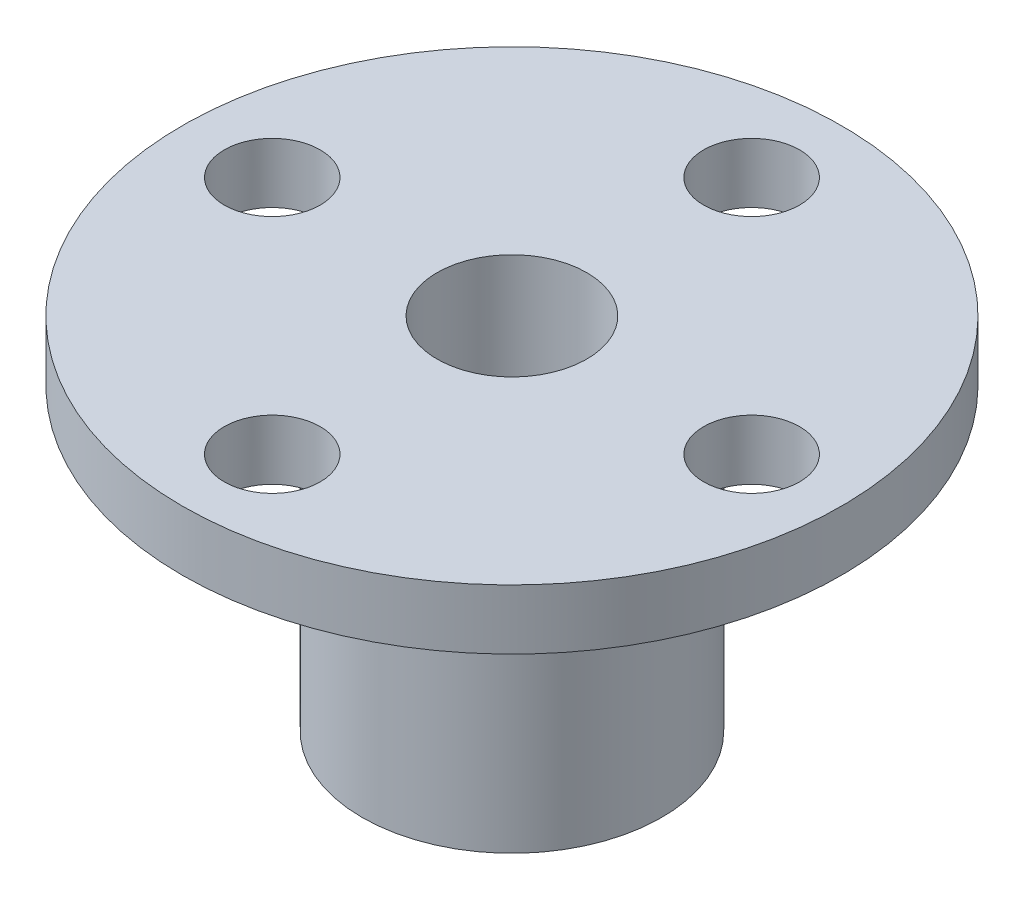
ISO-10303-21;
HEADER;
FILE_DESCRIPTION(('STEP AP214'),'2;1');
FILE_NAME('part.step','',(''),(''),'','','');
FILE_SCHEMA(('AUTOMOTIVE_DESIGN { 1 0 10303 214 1 1 1 1 }'));
ENDSEC;
DATA;
#1=APPLICATION_CONTEXT('core data for automotive mechanical design processes');
#2=APPLICATION_PROTOCOL_DEFINITION('international standard','automotive_design',2000,#1);
#3=PRODUCT_CONTEXT('',#1,'mechanical');
#4=PRODUCT('Part','Part','',(#3));
#5=PRODUCT_RELATED_PRODUCT_CATEGORY('part','',(#4));
#6=PRODUCT_DEFINITION_FORMATION('','',#4);
#7=PRODUCT_DEFINITION_CONTEXT('part definition',#1,'design');
#8=PRODUCT_DEFINITION('design','',#6,#7);
#9=PRODUCT_DEFINITION_SHAPE('','',#8);
#10=(LENGTH_UNIT() NAMED_UNIT(*) SI_UNIT(.MILLI.,.METRE.));
#11=(NAMED_UNIT(*) PLANE_ANGLE_UNIT() SI_UNIT($,.RADIAN.));
#12=(NAMED_UNIT(*) SI_UNIT($,.STERADIAN.) SOLID_ANGLE_UNIT());
#13=UNCERTAINTY_MEASURE_WITH_UNIT(LENGTH_MEASURE(1.E-05),#10,'distance_accuracy_value','');
#14=(GEOMETRIC_REPRESENTATION_CONTEXT(3) GLOBAL_UNCERTAINTY_ASSIGNED_CONTEXT((#13)) GLOBAL_UNIT_ASSIGNED_CONTEXT((#10,
#11,#12)) REPRESENTATION_CONTEXT('',''));
#15=CARTESIAN_POINT('',(0.,0.,0.));
#16=DIRECTION('',(0.,0.,1.));
#17=DIRECTION('',(1.,0.,0.));
#18=AXIS2_PLACEMENT_3D('',#15,#16,#17);
#19=CARTESIAN_POINT('',(0.,10.,0.));
#20=DIRECTION('',(0.,-1.,0.));
#21=DIRECTION('',(0.,0.,-1.));
#22=AXIS2_PLACEMENT_3D('',#19,#20,#21);
#23=CYLINDRICAL_SURFACE('',#22,5.);
#24=CARTESIAN_POINT('',(0.,10.,0.));
#25=DIRECTION('',(0.,1.,0.));
#26=DIRECTION('',(0.,0.,1.));
#27=AXIS2_PLACEMENT_3D('',#24,#25,#26);
#28=CIRCLE('',#27,5.);
#29=CARTESIAN_POINT('',(0.,10.,5.));
#30=VERTEX_POINT('',#29);
#31=EDGE_CURVE('E10',#30,#30,#28,.T.);
#32=ORIENTED_EDGE('',*,*,#31,.F.);
#33=EDGE_LOOP('',(#32));
#34=FACE_BOUND('',#33,.T.);
#35=CARTESIAN_POINT('',(0.,0.,0.));
#36=DIRECTION('',(0.,1.,0.));
#37=DIRECTION('',(0.,0.,1.));
#38=AXIS2_PLACEMENT_3D('',#35,#36,#37);
#39=CIRCLE('',#38,5.);
#40=CARTESIAN_POINT('',(0.,0.,5.));
#41=VERTEX_POINT('',#40);
#42=EDGE_CURVE('E40',#41,#41,#39,.T.);
#43=ORIENTED_EDGE('',*,*,#42,.T.);
#44=EDGE_LOOP('',(#43));
#45=FACE_BOUND('',#44,.T.);
#46=ADVANCED_FACE('F37',(#34,#45),#23,.T.);
#47=CARTESIAN_POINT('',(0.,0.,0.));
#48=DIRECTION('',(0.,1.,0.));
#49=DIRECTION('',(0.,0.,1.));
#50=AXIS2_PLACEMENT_3D('',#47,#48,#49);
#51=PLANE('',#50);
#52=CARTESIAN_POINT('',(0.,0.,0.));
#53=DIRECTION('',(0.,-1.,0.));
#54=DIRECTION('',(0.,0.,-1.));
#55=AXIS2_PLACEMENT_3D('',#52,#53,#54);
#56=CIRCLE('',#55,2.5);
#57=CARTESIAN_POINT('',(0.,0.,-2.5));
#58=VERTEX_POINT('',#57);
#59=EDGE_CURVE('E59',#58,#58,#56,.T.);
#60=ORIENTED_EDGE('',*,*,#59,.F.);
#61=EDGE_LOOP('',(#60));
#62=FACE_BOUND('',#61,.T.);
#63=ORIENTED_EDGE('',*,*,#42,.F.);
#64=EDGE_LOOP('',(#63));
#65=FACE_BOUND('',#64,.T.);
#66=ADVANCED_FACE('F105',(#62,#65),#51,.F.);
#67=CARTESIAN_POINT('',(0.,10.,0.));
#68=DIRECTION('',(0.,1.,0.));
#69=DIRECTION('',(0.,0.,1.));
#70=AXIS2_PLACEMENT_3D('',#67,#68,#69);
#71=PLANE('',#70);
#72=CARTESIAN_POINT('',(8.00000000000011,10.,0.));
#73=DIRECTION('',(0.,-1.,0.));
#74=DIRECTION('',(0.,0.,-1.));
#75=AXIS2_PLACEMENT_3D('',#72,#73,#74);
#76=CIRCLE('',#75,1.6);
#77=CARTESIAN_POINT('',(8.00000000000011,10.,-1.6));
#78=VERTEX_POINT('',#77);
#79=EDGE_CURVE('E87',#78,#78,#76,.T.);
#80=ORIENTED_EDGE('',*,*,#79,.F.);
#81=EDGE_LOOP('',(#80));
#82=FACE_BOUND('',#81,.T.);
#83=CARTESIAN_POINT('',(0.,10.,8.00000000000011));
#84=DIRECTION('',(0.,-1.,0.));
#85=DIRECTION('',(0.,0.,-1.));
#86=AXIS2_PLACEMENT_3D('',#83,#84,#85);
#87=CIRCLE('',#86,1.6);
#88=CARTESIAN_POINT('',(0.,10.,6.40000000000011));
#89=VERTEX_POINT('',#88);
#90=EDGE_CURVE('E79',#89,#89,#87,.T.);
#91=ORIENTED_EDGE('',*,*,#90,.F.);
#92=EDGE_LOOP('',(#91));
#93=FACE_BOUND('',#92,.T.);
#94=CARTESIAN_POINT('',(-8.00000000000011,10.,0.));
#95=DIRECTION('',(0.,-1.,0.));
#96=DIRECTION('',(0.,0.,-1.));
#97=AXIS2_PLACEMENT_3D('',#94,#95,#96);
#98=CIRCLE('',#97,1.6);
#99=CARTESIAN_POINT('',(-8.00000000000011,10.,-1.6));
#100=VERTEX_POINT('',#99);
#101=EDGE_CURVE('E71',#100,#100,#98,.T.);
#102=ORIENTED_EDGE('',*,*,#101,.F.);
#103=EDGE_LOOP('',(#102));
#104=FACE_BOUND('',#103,.T.);
#105=CARTESIAN_POINT('',(0.,10.,-8.00000000000011));
#106=DIRECTION('',(0.,-1.,0.));
#107=DIRECTION('',(0.,0.,-1.));
#108=AXIS2_PLACEMENT_3D('',#105,#106,#107);
#109=CIRCLE('',#108,1.6);
#110=CARTESIAN_POINT('',(0.,10.,-9.60000000000011));
#111=VERTEX_POINT('',#110);
#112=EDGE_CURVE('E63',#111,#111,#109,.T.);
#113=ORIENTED_EDGE('',*,*,#112,.F.);
#114=EDGE_LOOP('',(#113));
#115=FACE_BOUND('',#114,.T.);
#116=CARTESIAN_POINT('',(0.,10.,0.));
#117=DIRECTION('',(0.,1.,0.));
#118=DIRECTION('',(0.,0.,1.));
#119=AXIS2_PLACEMENT_3D('',#116,#117,#118);
#120=CIRCLE('',#119,11.);
#121=CARTESIAN_POINT('',(0.,10.,11.));
#122=VERTEX_POINT('',#121);
#123=EDGE_CURVE('E51',#122,#122,#120,.T.);
#124=ORIENTED_EDGE('',*,*,#123,.F.);
#125=EDGE_LOOP('',(#124));
#126=FACE_BOUND('',#125,.T.);
#127=ORIENTED_EDGE('',*,*,#31,.T.);
#128=EDGE_LOOP('',(#127));
#129=FACE_BOUND('',#128,.T.);
#130=ADVANCED_FACE('F101',(#82,#93,#104,#115,#126,#129),#71,.F.);
#131=CARTESIAN_POINT('',(0.,12.,0.));
#132=DIRECTION('',(0.,-1.,0.));
#133=DIRECTION('',(0.,0.,-1.));
#134=AXIS2_PLACEMENT_3D('',#131,#132,#133);
#135=CYLINDRICAL_SURFACE('',#134,11.);
#136=CARTESIAN_POINT('',(0.,12.,0.));
#137=DIRECTION('',(0.,1.,0.));
#138=DIRECTION('',(0.,0.,1.));
#139=AXIS2_PLACEMENT_3D('',#136,#137,#138);
#140=CIRCLE('',#139,11.);
#141=CARTESIAN_POINT('',(0.,12.,11.));
#142=VERTEX_POINT('',#141);
#143=EDGE_CURVE('E49',#142,#142,#140,.T.);
#144=ORIENTED_EDGE('',*,*,#143,.F.);
#145=EDGE_LOOP('',(#144));
#146=FACE_BOUND('',#145,.T.);
#147=ORIENTED_EDGE('',*,*,#123,.T.);
#148=EDGE_LOOP('',(#147));
#149=FACE_BOUND('',#148,.T.);
#150=ADVANCED_FACE('F104',(#146,#149),#135,.T.);
#151=CARTESIAN_POINT('',(0.,12.,0.));
#152=DIRECTION('',(0.,1.,0.));
#153=DIRECTION('',(0.,0.,1.));
#154=AXIS2_PLACEMENT_3D('',#151,#152,#153);
#155=PLANE('',#154);
#156=CARTESIAN_POINT('',(8.00000000000011,12.,0.));
#157=DIRECTION('',(0.,1.,0.));
#158=DIRECTION('',(0.,0.,1.));
#159=AXIS2_PLACEMENT_3D('',#156,#157,#158);
#160=CIRCLE('',#159,1.6);
#161=CARTESIAN_POINT('',(8.00000000000011,12.,1.6));
#162=VERTEX_POINT('',#161);
#163=EDGE_CURVE('E91',#162,#162,#160,.F.);
#164=ORIENTED_EDGE('',*,*,#163,.T.);
#165=EDGE_LOOP('',(#164));
#166=FACE_BOUND('',#165,.T.);
#167=CARTESIAN_POINT('',(0.,12.,8.00000000000011));
#168=DIRECTION('',(0.,1.,0.));
#169=DIRECTION('',(0.,0.,1.));
#170=AXIS2_PLACEMENT_3D('',#167,#168,#169);
#171=CIRCLE('',#170,1.6);
#172=CARTESIAN_POINT('',(0.,12.,9.60000000000011));
#173=VERTEX_POINT('',#172);
#174=EDGE_CURVE('E83',#173,#173,#171,.F.);
#175=ORIENTED_EDGE('',*,*,#174,.T.);
#176=EDGE_LOOP('',(#175));
#177=FACE_BOUND('',#176,.T.);
#178=CARTESIAN_POINT('',(-8.00000000000011,12.,0.));
#179=DIRECTION('',(0.,1.,0.));
#180=DIRECTION('',(0.,0.,1.));
#181=AXIS2_PLACEMENT_3D('',#178,#179,#180);
#182=CIRCLE('',#181,1.6);
#183=CARTESIAN_POINT('',(-8.00000000000011,12.,1.6));
#184=VERTEX_POINT('',#183);
#185=EDGE_CURVE('E75',#184,#184,#182,.F.);
#186=ORIENTED_EDGE('',*,*,#185,.T.);
#187=EDGE_LOOP('',(#186));
#188=FACE_BOUND('',#187,.T.);
#189=CARTESIAN_POINT('',(0.,12.,-8.00000000000011));
#190=DIRECTION('',(0.,1.,0.));
#191=DIRECTION('',(0.,0.,1.));
#192=AXIS2_PLACEMENT_3D('',#189,#190,#191);
#193=CIRCLE('',#192,1.6);
#194=CARTESIAN_POINT('',(0.,12.,-6.40000000000011));
#195=VERTEX_POINT('',#194);
#196=EDGE_CURVE('E67',#195,#195,#193,.F.);
#197=ORIENTED_EDGE('',*,*,#196,.T.);
#198=EDGE_LOOP('',(#197));
#199=FACE_BOUND('',#198,.T.);
#200=CARTESIAN_POINT('',(0.,12.,0.));
#201=DIRECTION('',(0.,-1.,0.));
#202=DIRECTION('',(0.,0.,-1.));
#203=AXIS2_PLACEMENT_3D('',#200,#201,#202);
#204=CIRCLE('',#203,2.5);
#205=CARTESIAN_POINT('',(0.,12.,-2.5));
#206=VERTEX_POINT('',#205);
#207=EDGE_CURVE('E55',#206,#206,#204,.T.);
#208=ORIENTED_EDGE('',*,*,#207,.T.);
#209=EDGE_LOOP('',(#208));
#210=FACE_BOUND('',#209,.T.);
#211=ORIENTED_EDGE('',*,*,#143,.T.);
#212=EDGE_LOOP('',(#211));
#213=FACE_BOUND('',#212,.T.);
#214=ADVANCED_FACE('F116',(#166,#177,#188,#199,#210,#213),#155,.T.);
#215=CARTESIAN_POINT('',(0.,12.,0.));
#216=DIRECTION('',(0.,-1.,0.));
#217=DIRECTION('',(0.,0.,-1.));
#218=AXIS2_PLACEMENT_3D('',#215,#216,#217);
#219=CYLINDRICAL_SURFACE('',#218,2.5);
#220=ORIENTED_EDGE('',*,*,#207,.F.);
#221=EDGE_LOOP('',(#220));
#222=FACE_BOUND('',#221,.T.);
#223=ORIENTED_EDGE('',*,*,#59,.T.);
#224=EDGE_LOOP('',(#223));
#225=FACE_BOUND('',#224,.T.);
#226=ADVANCED_FACE('F122',(#222,#225),#219,.F.);
#227=CARTESIAN_POINT('',(0.,12.001,-8.00000000000011));
#228=DIRECTION('',(0.,-1.,0.));
#229=DIRECTION('',(0.,0.,-1.));
#230=AXIS2_PLACEMENT_3D('',#227,#228,#229);
#231=CYLINDRICAL_SURFACE('',#230,1.6);
#232=ORIENTED_EDGE('',*,*,#196,.F.);
#233=EDGE_LOOP('',(#232));
#234=FACE_BOUND('',#233,.T.);
#235=ORIENTED_EDGE('',*,*,#112,.T.);
#236=EDGE_LOOP('',(#235));
#237=FACE_BOUND('',#236,.T.);
#238=ADVANCED_FACE('F140',(#234,#237),#231,.F.);
#239=CARTESIAN_POINT('',(-8.00000000000011,12.001,0.));
#240=DIRECTION('',(0.,-1.,0.));
#241=DIRECTION('',(0.,0.,-1.));
#242=AXIS2_PLACEMENT_3D('',#239,#240,#241);
#243=CYLINDRICAL_SURFACE('',#242,1.6);
#244=ORIENTED_EDGE('',*,*,#185,.F.);
#245=EDGE_LOOP('',(#244));
#246=FACE_BOUND('',#245,.T.);
#247=ORIENTED_EDGE('',*,*,#101,.T.);
#248=EDGE_LOOP('',(#247));
#249=FACE_BOUND('',#248,.T.);
#250=ADVANCED_FACE('F146',(#246,#249),#243,.F.);
#251=CARTESIAN_POINT('',(0.,12.001,8.00000000000011));
#252=DIRECTION('',(0.,-1.,0.));
#253=DIRECTION('',(0.,0.,-1.));
#254=AXIS2_PLACEMENT_3D('',#251,#252,#253);
#255=CYLINDRICAL_SURFACE('',#254,1.6);
#256=ORIENTED_EDGE('',*,*,#174,.F.);
#257=EDGE_LOOP('',(#256));
#258=FACE_BOUND('',#257,.T.);
#259=ORIENTED_EDGE('',*,*,#90,.T.);
#260=EDGE_LOOP('',(#259));
#261=FACE_BOUND('',#260,.T.);
#262=ADVANCED_FACE('F153',(#258,#261),#255,.F.);
#263=CARTESIAN_POINT('',(8.00000000000011,12.001,0.));
#264=DIRECTION('',(0.,-1.,0.));
#265=DIRECTION('',(0.,0.,-1.));
#266=AXIS2_PLACEMENT_3D('',#263,#264,#265);
#267=CYLINDRICAL_SURFACE('',#266,1.6);
#268=ORIENTED_EDGE('',*,*,#163,.F.);
#269=EDGE_LOOP('',(#268));
#270=FACE_BOUND('',#269,.T.);
#271=ORIENTED_EDGE('',*,*,#79,.T.);
#272=EDGE_LOOP('',(#271));
#273=FACE_BOUND('',#272,.T.);
#274=ADVANCED_FACE('F99',(#270,#273),#267,.F.);
#275=CLOSED_SHELL('',(#46,#66,#130,#150,#214,#226,#238,#250,#262,#274));
#276=MANIFOLD_SOLID_BREP('B2',#275);
#277=ADVANCED_BREP_SHAPE_REPRESENTATION('',(#18,#276),#14);
#278=SHAPE_DEFINITION_REPRESENTATION(#9,#277);
ENDSEC;
END-ISO-10303-21;
